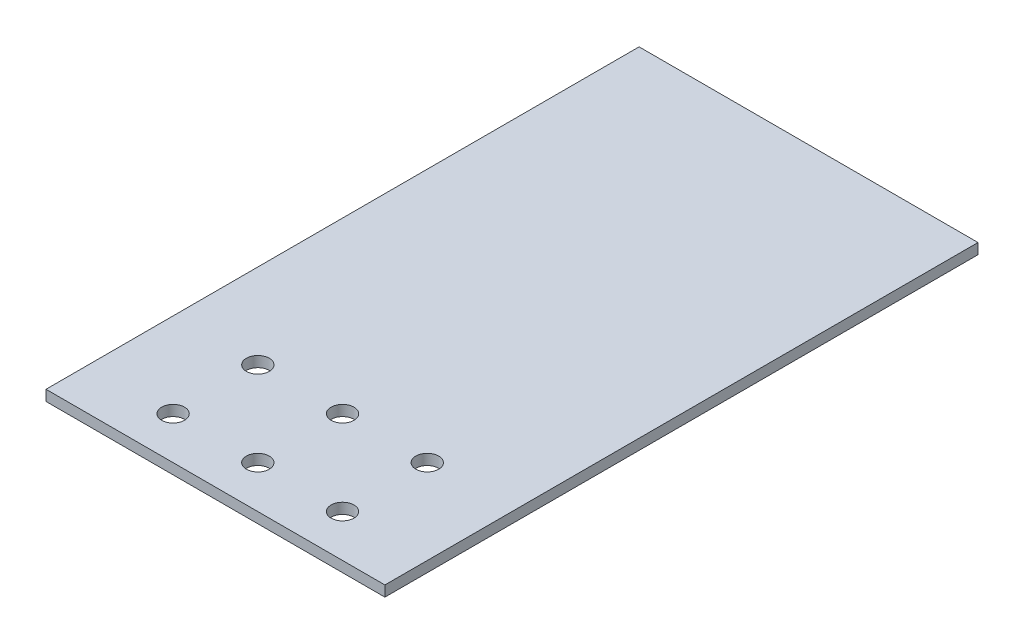
ISO-10303-21;
HEADER;
FILE_DESCRIPTION(('STEP AP214'),'2;1');
FILE_NAME('part.step','',(''),(''),'','','');
FILE_SCHEMA(('AUTOMOTIVE_DESIGN { 1 0 10303 214 1 1 1 1 }'));
ENDSEC;
DATA;
#1=APPLICATION_CONTEXT('core data for automotive mechanical design processes');
#2=APPLICATION_PROTOCOL_DEFINITION('international standard','automotive_design',2000,#1);
#3=PRODUCT_CONTEXT('',#1,'mechanical');
#4=PRODUCT('Part','Part','',(#3));
#5=PRODUCT_RELATED_PRODUCT_CATEGORY('part','',(#4));
#6=PRODUCT_DEFINITION_FORMATION('','',#4);
#7=PRODUCT_DEFINITION_CONTEXT('part definition',#1,'design');
#8=PRODUCT_DEFINITION('design','',#6,#7);
#9=PRODUCT_DEFINITION_SHAPE('','',#8);
#10=(LENGTH_UNIT() NAMED_UNIT(*) SI_UNIT(.MILLI.,.METRE.));
#11=(NAMED_UNIT(*) PLANE_ANGLE_UNIT() SI_UNIT($,.RADIAN.));
#12=(NAMED_UNIT(*) SI_UNIT($,.STERADIAN.) SOLID_ANGLE_UNIT());
#13=UNCERTAINTY_MEASURE_WITH_UNIT(LENGTH_MEASURE(1.E-05),#10,'distance_accuracy_value','');
#14=(GEOMETRIC_REPRESENTATION_CONTEXT(3) GLOBAL_UNCERTAINTY_ASSIGNED_CONTEXT((#13)) GLOBAL_UNIT_ASSIGNED_CONTEXT((#10,
#11,#12)) REPRESENTATION_CONTEXT('',''));
#15=CARTESIAN_POINT('',(0.,0.,0.));
#16=DIRECTION('',(0.,0.,1.));
#17=DIRECTION('',(1.,0.,0.));
#18=AXIS2_PLACEMENT_3D('',#15,#16,#17);
#19=CARTESIAN_POINT('',(0.,3.175,0.));
#20=DIRECTION('',(0.,-1.,0.));
#21=DIRECTION('',(0.,0.,-1.));
#22=AXIS2_PLACEMENT_3D('',#19,#20,#21);
#23=PLANE('',#22);
#24=DIRECTION('',(0.,0.,-1.));
#25=VECTOR('',#24,1.);
#26=CARTESIAN_POINT('',(50.8,3.175,88.9));
#27=LINE('',#26,#25);
#28=CARTESIAN_POINT('',(50.8,3.175,88.9));
#29=VERTEX_POINT('',#28);
#30=CARTESIAN_POINT('',(50.8,3.175,-88.9));
#31=VERTEX_POINT('',#30);
#32=EDGE_CURVE('E84',#29,#31,#27,.T.);
#33=ORIENTED_EDGE('',*,*,#32,.T.);
#34=DIRECTION('',(-1.,0.,0.));
#35=VECTOR('',#34,1.);
#36=CARTESIAN_POINT('',(-50.8,3.175,-88.9));
#37=LINE('',#36,#35);
#38=CARTESIAN_POINT('',(-50.8,3.175,-88.9));
#39=VERTEX_POINT('',#38);
#40=EDGE_CURVE('E79',#31,#39,#37,.T.);
#41=ORIENTED_EDGE('',*,*,#40,.T.);
#42=DIRECTION('',(0.,0.,1.));
#43=VECTOR('',#42,1.);
#44=CARTESIAN_POINT('',(-50.8,3.175,88.9));
#45=LINE('',#44,#43);
#46=CARTESIAN_POINT('',(-50.8,3.175,88.9));
#47=VERTEX_POINT('',#46);
#48=EDGE_CURVE('E82',#39,#47,#45,.T.);
#49=ORIENTED_EDGE('',*,*,#48,.T.);
#50=DIRECTION('',(1.,0.,0.));
#51=VECTOR('',#50,1.);
#52=CARTESIAN_POINT('',(-50.8,3.175,88.9));
#53=LINE('',#52,#51);
#54=EDGE_CURVE('E49',#47,#29,#53,.T.);
#55=ORIENTED_EDGE('',*,*,#54,.T.);
#56=EDGE_LOOP('',(#33,#41,#49,#55));
#57=FACE_BOUND('',#56,.T.);
#58=CARTESIAN_POINT('',(-25.4,3.175,76.2));
#59=DIRECTION('',(0.,1.,0.));
#60=DIRECTION('',(0.,0.,1.));
#61=AXIS2_PLACEMENT_3D('',#58,#59,#60);
#62=CIRCLE('',#61,3.42900000000001);
#63=CARTESIAN_POINT('',(-25.4,3.175,79.629));
#64=VERTEX_POINT('',#63);
#65=EDGE_CURVE('E99',#64,#64,#62,.T.);
#66=ORIENTED_EDGE('',*,*,#65,.F.);
#67=EDGE_LOOP('',(#66));
#68=FACE_BOUND('',#67,.T.);
#69=CARTESIAN_POINT('',(0.,3.175,76.2));
#70=DIRECTION('',(0.,1.,0.));
#71=DIRECTION('',(0.,0.,1.));
#72=AXIS2_PLACEMENT_3D('',#69,#70,#71);
#73=CIRCLE('',#72,3.42900000000001);
#74=CARTESIAN_POINT('',(0.,3.175,79.629));
#75=VERTEX_POINT('',#74);
#76=EDGE_CURVE('E114',#75,#75,#73,.T.);
#77=ORIENTED_EDGE('',*,*,#76,.F.);
#78=EDGE_LOOP('',(#77));
#79=FACE_BOUND('',#78,.T.);
#80=CARTESIAN_POINT('',(25.4,3.175,76.2));
#81=DIRECTION('',(0.,1.,0.));
#82=DIRECTION('',(0.,0.,1.));
#83=AXIS2_PLACEMENT_3D('',#80,#81,#82);
#84=CIRCLE('',#83,3.42900000000001);
#85=CARTESIAN_POINT('',(25.4,3.175,79.629));
#86=VERTEX_POINT('',#85);
#87=EDGE_CURVE('E120',#86,#86,#84,.T.);
#88=ORIENTED_EDGE('',*,*,#87,.F.);
#89=EDGE_LOOP('',(#88));
#90=FACE_BOUND('',#89,.T.);
#91=CARTESIAN_POINT('',(-1.04083408558608E-13,3.175,50.8));
#92=DIRECTION('',(0.,1.,0.));
#93=DIRECTION('',(0.,0.,1.));
#94=AXIS2_PLACEMENT_3D('',#91,#92,#93);
#95=CIRCLE('',#94,3.42900000000001);
#96=CARTESIAN_POINT('',(-1.04083408558608E-13,3.175,54.229));
#97=VERTEX_POINT('',#96);
#98=EDGE_CURVE('E126',#97,#97,#95,.T.);
#99=ORIENTED_EDGE('',*,*,#98,.F.);
#100=EDGE_LOOP('',(#99));
#101=FACE_BOUND('',#100,.T.);
#102=CARTESIAN_POINT('',(25.3999999999999,3.175,50.8));
#103=DIRECTION('',(0.,1.,0.));
#104=DIRECTION('',(0.,0.,1.));
#105=AXIS2_PLACEMENT_3D('',#102,#103,#104);
#106=CIRCLE('',#105,3.42900000000001);
#107=CARTESIAN_POINT('',(25.3999999999999,3.175,54.229));
#108=VERTEX_POINT('',#107);
#109=EDGE_CURVE('E132',#108,#108,#106,.T.);
#110=ORIENTED_EDGE('',*,*,#109,.F.);
#111=EDGE_LOOP('',(#110));
#112=FACE_BOUND('',#111,.T.);
#113=CARTESIAN_POINT('',(-25.4000000000001,3.175,50.8));
#114=DIRECTION('',(0.,1.,0.));
#115=DIRECTION('',(0.,0.,1.));
#116=AXIS2_PLACEMENT_3D('',#113,#114,#115);
#117=CIRCLE('',#116,3.42900000000001);
#118=CARTESIAN_POINT('',(-25.4000000000001,3.175,54.229));
#119=VERTEX_POINT('',#118);
#120=EDGE_CURVE('E138',#119,#119,#117,.T.);
#121=ORIENTED_EDGE('',*,*,#120,.F.);
#122=EDGE_LOOP('',(#121));
#123=FACE_BOUND('',#122,.T.);
#124=ADVANCED_FACE('F32',(#57,#68,#79,#90,#101,#112,#123),#23,.F.);
#125=CARTESIAN_POINT('',(0.,0.,0.));
#126=DIRECTION('',(0.,-1.,0.));
#127=DIRECTION('',(0.,0.,-1.));
#128=AXIS2_PLACEMENT_3D('',#125,#126,#127);
#129=PLANE('',#128);
#130=CARTESIAN_POINT('',(25.3999999999999,0.,50.8));
#131=DIRECTION('',(0.,1.,0.));
#132=DIRECTION('',(0.,0.,1.));
#133=AXIS2_PLACEMENT_3D('',#130,#131,#132);
#134=CIRCLE('',#133,3.42900000000001);
#135=CARTESIAN_POINT('',(25.3999999999999,0.,54.229));
#136=VERTEX_POINT('',#135);
#137=EDGE_CURVE('E135',#136,#136,#134,.T.);
#138=ORIENTED_EDGE('',*,*,#137,.T.);
#139=EDGE_LOOP('',(#138));
#140=FACE_BOUND('',#139,.T.);
#141=CARTESIAN_POINT('',(25.4,0.,76.2));
#142=DIRECTION('',(0.,1.,0.));
#143=DIRECTION('',(0.,0.,1.));
#144=AXIS2_PLACEMENT_3D('',#141,#142,#143);
#145=CIRCLE('',#144,3.42900000000001);
#146=CARTESIAN_POINT('',(25.4,0.,79.629));
#147=VERTEX_POINT('',#146);
#148=EDGE_CURVE('E123',#147,#147,#145,.T.);
#149=ORIENTED_EDGE('',*,*,#148,.T.);
#150=EDGE_LOOP('',(#149));
#151=FACE_BOUND('',#150,.T.);
#152=CARTESIAN_POINT('',(-25.4,0.,76.2));
#153=DIRECTION('',(0.,1.,0.));
#154=DIRECTION('',(0.,0.,1.));
#155=AXIS2_PLACEMENT_3D('',#152,#153,#154);
#156=CIRCLE('',#155,3.42900000000001);
#157=CARTESIAN_POINT('',(-25.4,0.,79.629));
#158=VERTEX_POINT('',#157);
#159=EDGE_CURVE('E111',#158,#158,#156,.T.);
#160=ORIENTED_EDGE('',*,*,#159,.T.);
#161=EDGE_LOOP('',(#160));
#162=FACE_BOUND('',#161,.T.);
#163=DIRECTION('',(0.,0.,-1.));
#164=VECTOR('',#163,1.);
#165=CARTESIAN_POINT('',(50.8,0.,88.9));
#166=LINE('',#165,#164);
#167=CARTESIAN_POINT('',(50.8,0.,88.9));
#168=VERTEX_POINT('',#167);
#169=CARTESIAN_POINT('',(50.8,0.,-88.9));
#170=VERTEX_POINT('',#169);
#171=EDGE_CURVE('E96',#168,#170,#166,.T.);
#172=ORIENTED_EDGE('',*,*,#171,.F.);
#173=DIRECTION('',(1.,0.,0.));
#174=VECTOR('',#173,1.);
#175=CARTESIAN_POINT('',(-50.8,0.,88.9));
#176=LINE('',#175,#174);
#177=CARTESIAN_POINT('',(-50.8,0.,88.9));
#178=VERTEX_POINT('',#177);
#179=EDGE_CURVE('E72',#178,#168,#176,.T.);
#180=ORIENTED_EDGE('',*,*,#179,.F.);
#181=DIRECTION('',(0.,0.,1.));
#182=VECTOR('',#181,1.);
#183=CARTESIAN_POINT('',(-50.8,0.,88.9));
#184=LINE('',#183,#182);
#185=CARTESIAN_POINT('',(-50.8,0.,-88.9));
#186=VERTEX_POINT('',#185);
#187=EDGE_CURVE('E66',#186,#178,#184,.T.);
#188=ORIENTED_EDGE('',*,*,#187,.F.);
#189=DIRECTION('',(-1.,0.,0.));
#190=VECTOR('',#189,1.);
#191=CARTESIAN_POINT('',(-50.8,0.,-88.9));
#192=LINE('',#191,#190);
#193=EDGE_CURVE('E88',#170,#186,#192,.T.);
#194=ORIENTED_EDGE('',*,*,#193,.F.);
#195=EDGE_LOOP('',(#172,#180,#188,#194));
#196=FACE_BOUND('',#195,.T.);
#197=CARTESIAN_POINT('',(0.,0.,76.2));
#198=DIRECTION('',(0.,1.,0.));
#199=DIRECTION('',(0.,0.,1.));
#200=AXIS2_PLACEMENT_3D('',#197,#198,#199);
#201=CIRCLE('',#200,3.42900000000001);
#202=CARTESIAN_POINT('',(0.,0.,79.629));
#203=VERTEX_POINT('',#202);
#204=EDGE_CURVE('E117',#203,#203,#201,.T.);
#205=ORIENTED_EDGE('',*,*,#204,.T.);
#206=EDGE_LOOP('',(#205));
#207=FACE_BOUND('',#206,.T.);
#208=CARTESIAN_POINT('',(-1.04083408558608E-13,0.,50.8));
#209=DIRECTION('',(0.,1.,0.));
#210=DIRECTION('',(0.,0.,1.));
#211=AXIS2_PLACEMENT_3D('',#208,#209,#210);
#212=CIRCLE('',#211,3.42900000000001);
#213=CARTESIAN_POINT('',(-1.04083408558608E-13,0.,54.229));
#214=VERTEX_POINT('',#213);
#215=EDGE_CURVE('E129',#214,#214,#212,.T.);
#216=ORIENTED_EDGE('',*,*,#215,.T.);
#217=EDGE_LOOP('',(#216));
#218=FACE_BOUND('',#217,.T.);
#219=CARTESIAN_POINT('',(-25.4000000000001,0.,50.8));
#220=DIRECTION('',(0.,1.,0.));
#221=DIRECTION('',(0.,0.,1.));
#222=AXIS2_PLACEMENT_3D('',#219,#220,#221);
#223=CIRCLE('',#222,3.42900000000001);
#224=CARTESIAN_POINT('',(-25.4000000000001,0.,54.229));
#225=VERTEX_POINT('',#224);
#226=EDGE_CURVE('E141',#225,#225,#223,.T.);
#227=ORIENTED_EDGE('',*,*,#226,.T.);
#228=EDGE_LOOP('',(#227));
#229=FACE_BOUND('',#228,.T.);
#230=ADVANCED_FACE('F107',(#140,#151,#162,#196,#207,#218,#229),#129,.T.);
#231=CARTESIAN_POINT('',(50.8,3.175,88.9));
#232=DIRECTION('',(-1.,0.,0.));
#233=DIRECTION('',(0.,0.,1.));
#234=AXIS2_PLACEMENT_3D('',#231,#232,#233);
#235=PLANE('',#234);
#236=ORIENTED_EDGE('',*,*,#171,.T.);
#237=DIRECTION('',(0.,-1.,0.));
#238=VECTOR('',#237,1.);
#239=CARTESIAN_POINT('',(50.8,3.175,-88.9));
#240=LINE('',#239,#238);
#241=EDGE_CURVE('E11',#31,#170,#240,.T.);
#242=ORIENTED_EDGE('',*,*,#241,.F.);
#243=ORIENTED_EDGE('',*,*,#32,.F.);
#244=DIRECTION('',(0.,-1.,0.));
#245=VECTOR('',#244,1.);
#246=CARTESIAN_POINT('',(50.8,3.175,88.9));
#247=LINE('',#246,#245);
#248=EDGE_CURVE('E92',#29,#168,#247,.T.);
#249=ORIENTED_EDGE('',*,*,#248,.T.);
#250=EDGE_LOOP('',(#236,#242,#243,#249));
#251=FACE_BOUND('',#250,.T.);
#252=ADVANCED_FACE('F34',(#251),#235,.F.);
#253=CARTESIAN_POINT('',(-50.8,3.175,-88.9));
#254=DIRECTION('',(0.,0.,1.));
#255=DIRECTION('',(1.,0.,0.));
#256=AXIS2_PLACEMENT_3D('',#253,#254,#255);
#257=PLANE('',#256);
#258=ORIENTED_EDGE('',*,*,#193,.T.);
#259=DIRECTION('',(0.,-1.,0.));
#260=VECTOR('',#259,1.);
#261=CARTESIAN_POINT('',(-50.8,3.175,-88.9));
#262=LINE('',#261,#260);
#263=EDGE_CURVE('E41',#39,#186,#262,.T.);
#264=ORIENTED_EDGE('',*,*,#263,.F.);
#265=ORIENTED_EDGE('',*,*,#40,.F.);
#266=ORIENTED_EDGE('',*,*,#241,.T.);
#267=EDGE_LOOP('',(#258,#264,#265,#266));
#268=FACE_BOUND('',#267,.T.);
#269=ADVANCED_FACE('F87',(#268),#257,.F.);
#270=CARTESIAN_POINT('',(-50.8,3.175,88.9));
#271=DIRECTION('',(1.,0.,0.));
#272=DIRECTION('',(0.,0.,-1.));
#273=AXIS2_PLACEMENT_3D('',#270,#271,#272);
#274=PLANE('',#273);
#275=ORIENTED_EDGE('',*,*,#187,.T.);
#276=DIRECTION('',(0.,-1.,0.));
#277=VECTOR('',#276,1.);
#278=CARTESIAN_POINT('',(-50.8,3.175,88.9));
#279=LINE('',#278,#277);
#280=EDGE_CURVE('E89',#47,#178,#279,.T.);
#281=ORIENTED_EDGE('',*,*,#280,.F.);
#282=ORIENTED_EDGE('',*,*,#48,.F.);
#283=ORIENTED_EDGE('',*,*,#263,.T.);
#284=EDGE_LOOP('',(#275,#281,#282,#283));
#285=FACE_BOUND('',#284,.T.);
#286=ADVANCED_FACE('F90',(#285),#274,.F.);
#287=CARTESIAN_POINT('',(-50.8,3.175,88.9));
#288=DIRECTION('',(0.,0.,-1.));
#289=DIRECTION('',(-1.,0.,0.));
#290=AXIS2_PLACEMENT_3D('',#287,#288,#289);
#291=PLANE('',#290);
#292=ORIENTED_EDGE('',*,*,#179,.T.);
#293=ORIENTED_EDGE('',*,*,#248,.F.);
#294=ORIENTED_EDGE('',*,*,#54,.F.);
#295=ORIENTED_EDGE('',*,*,#280,.T.);
#296=EDGE_LOOP('',(#292,#293,#294,#295));
#297=FACE_BOUND('',#296,.T.);
#298=ADVANCED_FACE('F104',(#297),#291,.F.);
#299=CARTESIAN_POINT('',(-25.4,3.175,76.2));
#300=DIRECTION('',(0.,-1.,0.));
#301=DIRECTION('',(0.,0.,-1.));
#302=AXIS2_PLACEMENT_3D('',#299,#300,#301);
#303=CYLINDRICAL_SURFACE('',#302,3.42900000000001);
#304=ORIENTED_EDGE('',*,*,#65,.T.);
#305=EDGE_LOOP('',(#304));
#306=FACE_BOUND('',#305,.T.);
#307=ORIENTED_EDGE('',*,*,#159,.F.);
#308=EDGE_LOOP('',(#307));
#309=FACE_BOUND('',#308,.T.);
#310=ADVANCED_FACE('F158',(#306,#309),#303,.F.);
#311=CARTESIAN_POINT('',(0.,3.175,76.2));
#312=DIRECTION('',(0.,-1.,0.));
#313=DIRECTION('',(0.,0.,-1.));
#314=AXIS2_PLACEMENT_3D('',#311,#312,#313);
#315=CYLINDRICAL_SURFACE('',#314,3.42900000000001);
#316=ORIENTED_EDGE('',*,*,#76,.T.);
#317=EDGE_LOOP('',(#316));
#318=FACE_BOUND('',#317,.T.);
#319=ORIENTED_EDGE('',*,*,#204,.F.);
#320=EDGE_LOOP('',(#319));
#321=FACE_BOUND('',#320,.T.);
#322=ADVANCED_FACE('F204',(#318,#321),#315,.F.);
#323=CARTESIAN_POINT('',(25.4,3.175,76.2));
#324=DIRECTION('',(0.,-1.,0.));
#325=DIRECTION('',(0.,0.,-1.));
#326=AXIS2_PLACEMENT_3D('',#323,#324,#325);
#327=CYLINDRICAL_SURFACE('',#326,3.42900000000001);
#328=ORIENTED_EDGE('',*,*,#87,.T.);
#329=EDGE_LOOP('',(#328));
#330=FACE_BOUND('',#329,.T.);
#331=ORIENTED_EDGE('',*,*,#148,.F.);
#332=EDGE_LOOP('',(#331));
#333=FACE_BOUND('',#332,.T.);
#334=ADVANCED_FACE('F212',(#330,#333),#327,.F.);
#335=CARTESIAN_POINT('',(-1.04083408558608E-13,3.175,50.8));
#336=DIRECTION('',(0.,-1.,0.));
#337=DIRECTION('',(0.,0.,-1.));
#338=AXIS2_PLACEMENT_3D('',#335,#336,#337);
#339=CYLINDRICAL_SURFACE('',#338,3.42900000000001);
#340=ORIENTED_EDGE('',*,*,#98,.T.);
#341=EDGE_LOOP('',(#340));
#342=FACE_BOUND('',#341,.T.);
#343=ORIENTED_EDGE('',*,*,#215,.F.);
#344=EDGE_LOOP('',(#343));
#345=FACE_BOUND('',#344,.T.);
#346=ADVANCED_FACE('F220',(#342,#345),#339,.F.);
#347=CARTESIAN_POINT('',(25.3999999999999,3.175,50.8));
#348=DIRECTION('',(0.,-1.,0.));
#349=DIRECTION('',(0.,0.,-1.));
#350=AXIS2_PLACEMENT_3D('',#347,#348,#349);
#351=CYLINDRICAL_SURFACE('',#350,3.42900000000001);
#352=ORIENTED_EDGE('',*,*,#109,.T.);
#353=EDGE_LOOP('',(#352));
#354=FACE_BOUND('',#353,.T.);
#355=ORIENTED_EDGE('',*,*,#137,.F.);
#356=EDGE_LOOP('',(#355));
#357=FACE_BOUND('',#356,.T.);
#358=ADVANCED_FACE('F229',(#354,#357),#351,.F.);
#359=CARTESIAN_POINT('',(-25.4000000000001,3.175,50.8));
#360=DIRECTION('',(0.,-1.,0.));
#361=DIRECTION('',(0.,0.,-1.));
#362=AXIS2_PLACEMENT_3D('',#359,#360,#361);
#363=CYLINDRICAL_SURFACE('',#362,3.42900000000001);
#364=ORIENTED_EDGE('',*,*,#120,.T.);
#365=EDGE_LOOP('',(#364));
#366=FACE_BOUND('',#365,.T.);
#367=ORIENTED_EDGE('',*,*,#226,.F.);
#368=EDGE_LOOP('',(#367));
#369=FACE_BOUND('',#368,.T.);
#370=ADVANCED_FACE('F147',(#366,#369),#363,.F.);
#371=CLOSED_SHELL('',(#124,#230,#252,#269,#286,#298,#310,#322,#334,#346,#358,#370));
#372=MANIFOLD_SOLID_BREP('B2',#371);
#373=ADVANCED_BREP_SHAPE_REPRESENTATION('',(#18,#372),#14);
#374=SHAPE_DEFINITION_REPRESENTATION(#9,#373);
ENDSEC;
END-ISO-10303-21;
